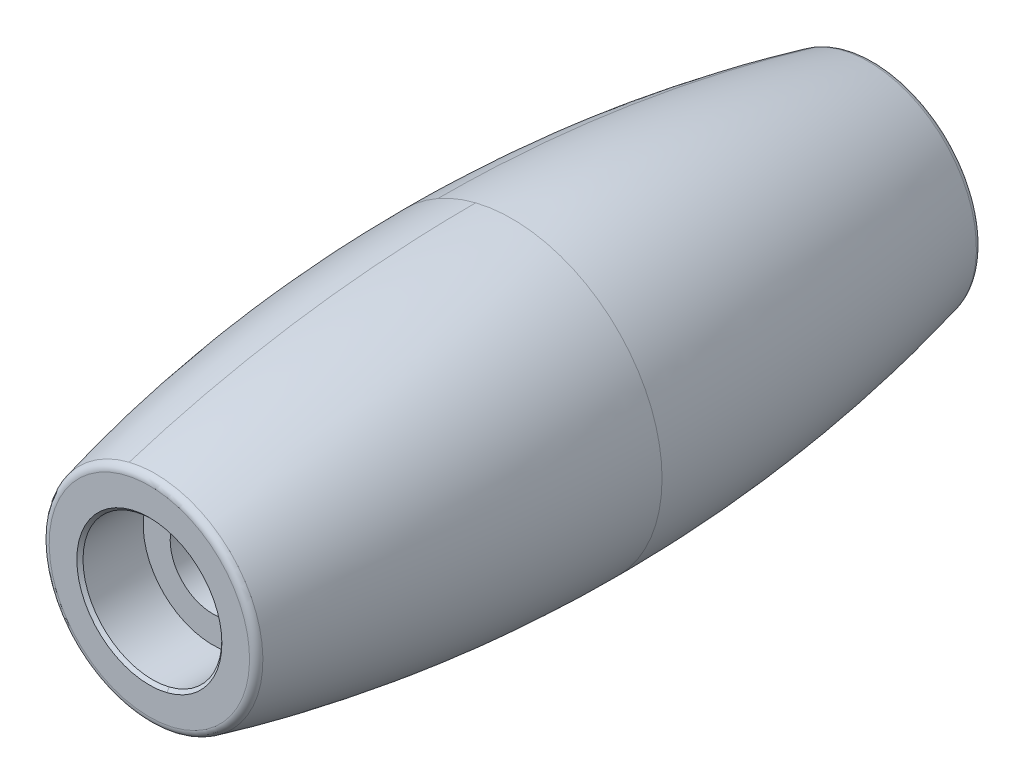
ISO-10303-21;
HEADER;
FILE_DESCRIPTION(('STEP AP214'),'2;1');
FILE_NAME('part.step','',(''),(''),'','','');
FILE_SCHEMA(('AUTOMOTIVE_DESIGN { 1 0 10303 214 1 1 1 1 }'));
ENDSEC;
DATA;
#1=APPLICATION_CONTEXT('core data for automotive mechanical design processes');
#2=APPLICATION_PROTOCOL_DEFINITION('international standard','automotive_design',2000,#1);
#3=PRODUCT_CONTEXT('',#1,'mechanical');
#4=PRODUCT('Part','Part','',(#3));
#5=PRODUCT_RELATED_PRODUCT_CATEGORY('part','',(#4));
#6=PRODUCT_DEFINITION_FORMATION('','',#4);
#7=PRODUCT_DEFINITION_CONTEXT('part definition',#1,'design');
#8=PRODUCT_DEFINITION('design','',#6,#7);
#9=PRODUCT_DEFINITION_SHAPE('','',#8);
#10=(LENGTH_UNIT() NAMED_UNIT(*) SI_UNIT(.MILLI.,.METRE.));
#11=(NAMED_UNIT(*) PLANE_ANGLE_UNIT() SI_UNIT($,.RADIAN.));
#12=(NAMED_UNIT(*) SI_UNIT($,.STERADIAN.) SOLID_ANGLE_UNIT());
#13=UNCERTAINTY_MEASURE_WITH_UNIT(LENGTH_MEASURE(1.E-05),#10,'distance_accuracy_value','');
#14=(GEOMETRIC_REPRESENTATION_CONTEXT(3) GLOBAL_UNCERTAINTY_ASSIGNED_CONTEXT((#13)) GLOBAL_UNIT_ASSIGNED_CONTEXT((#10,
#11,#12)) REPRESENTATION_CONTEXT('',''));
#15=CARTESIAN_POINT('',(0.,0.,0.));
#16=DIRECTION('',(0.,0.,1.));
#17=DIRECTION('',(1.,0.,0.));
#18=AXIS2_PLACEMENT_3D('',#15,#16,#17);
#19=CARTESIAN_POINT('',(-25.4705380913365,35.1579678977231,0.));
#20=DIRECTION('',(0.,0.,1.));
#21=DIRECTION('',(1.,0.,0.));
#22=AXIS2_PLACEMENT_3D('',#19,#20,#21);
#23=PLANE('',#22);
#24=CARTESIAN_POINT('',(-25.4705380913339,35.1579678977162,-5.38371430769402E-12));
#25=DIRECTION('',(0.,0.,1.));
#26=DIRECTION('',(1.,0.,0.));
#27=AXIS2_PLACEMENT_3D('',#24,#25,#26);
#28=CIRCLE('',#27,4.5);
#29=CARTESIAN_POINT('',(-20.9705380913339,35.1579678977162,-5.38509601494264E-12));
#30=VERTEX_POINT('',#29);
#31=EDGE_CURVE('E116',#30,#30,#28,.T.);
#32=ORIENTED_EDGE('',*,*,#31,.T.);
#33=EDGE_LOOP('',(#32));
#34=FACE_BOUND('',#33,.T.);
#35=CARTESIAN_POINT('',(-25.4705380913339,35.1579678977162,-1.4363510381088E-12));
#36=DIRECTION('',(0.,0.,-1.));
#37=DIRECTION('',(-1.,0.,0.));
#38=AXIS2_PLACEMENT_3D('',#35,#36,#37);
#39=CIRCLE('',#38,2.75);
#40=CARTESIAN_POINT('',(-28.2205380913339,35.1579678977162,-1.43550666145686E-12));
#41=VERTEX_POINT('',#40);
#42=EDGE_CURVE('E119',#41,#41,#39,.T.);
#43=ORIENTED_EDGE('',*,*,#42,.T.);
#44=EDGE_LOOP('',(#43));
#45=FACE_BOUND('',#44,.T.);
#46=ADVANCED_FACE('F16',(#34,#45),#23,.T.);
#47=CARTESIAN_POINT('',(-25.4705380913339,35.1579678977162,4.09999999999955));
#48=DIRECTION('',(0.,0.,-1.));
#49=DIRECTION('',(-1.,0.,0.));
#50=AXIS2_PLACEMENT_3D('',#47,#48,#49);
#51=CYLINDRICAL_SURFACE('',#50,2.75);
#52=ORIENTED_EDGE('',*,*,#42,.F.);
#53=EDGE_LOOP('',(#52));
#54=FACE_BOUND('',#53,.T.);
#55=CARTESIAN_POINT('',(-25.4705380913339,35.1579678977162,-38.8000000000043));
#56=DIRECTION('',(0.,0.,-1.));
#57=DIRECTION('',(-1.,0.,0.));
#58=AXIS2_PLACEMENT_3D('',#55,#56,#57);
#59=CIRCLE('',#58,2.75);
#60=CARTESIAN_POINT('',(-28.2205380913339,35.1579678977162,-38.8000000000043));
#61=VERTEX_POINT('',#60);
#62=EDGE_CURVE('E112',#61,#61,#59,.F.);
#63=ORIENTED_EDGE('',*,*,#62,.F.);
#64=EDGE_LOOP('',(#63));
#65=FACE_BOUND('',#64,.T.);
#66=ADVANCED_FACE('F383',(#54,#65),#51,.F.);
#67=CARTESIAN_POINT('',(-25.4705380913339,35.1579678977162,4.09999999999955));
#68=DIRECTION('',(0.,0.,1.));
#69=DIRECTION('',(1.,0.,0.));
#70=AXIS2_PLACEMENT_3D('',#67,#68,#69);
#71=CYLINDRICAL_SURFACE('',#70,4.5);
#72=ORIENTED_EDGE('',*,*,#31,.F.);
#73=EDGE_LOOP('',(#72));
#74=FACE_BOUND('',#73,.T.);
#75=CARTESIAN_POINT('',(-25.4705380913304,35.1579678977177,3.89999999998735));
#76=DIRECTION('',(0.,0.,1.));
#77=DIRECTION('',(-0.992768102714452,-0.12004788308316,0.));
#78=AXIS2_PLACEMENT_3D('',#75,#76,#77);
#79=CIRCLE('',#78,4.50000000001804);
#80=CARTESIAN_POINT('',(-26.5593346272201,39.5242617612346,3.89999999987367));
#81=VERTEX_POINT('',#80);
#82=CARTESIAN_POINT('',(-24.381741555437,30.7916740341321,3.89999999991156));
#83=VERTEX_POINT('',#82);
#84=EDGE_CURVE('E115',#81,#83,#79,.T.);
#85=ORIENTED_EDGE('',*,*,#84,.T.);
#86=CARTESIAN_POINT('',(-25.4705380913304,35.1579678977177,3.89999999987367));
#87=DIRECTION('',(0.,0.,1.));
#88=DIRECTION('',(-0.992768102714646,-0.120047883081553,0.));
#89=AXIS2_PLACEMENT_3D('',#86,#87,#88);
#90=CIRCLE('',#89,4.4999999999599);
#91=EDGE_CURVE('E100',#83,#81,#90,.T.);
#92=ORIENTED_EDGE('',*,*,#91,.T.);
#93=EDGE_LOOP('',(#85,#92));
#94=FACE_BOUND('',#93,.T.);
#95=ADVANCED_FACE('F374',(#74,#94),#71,.F.);
#96=CARTESIAN_POINT('',(-25.4705380913347,35.1579678977238,-38.8000000000057));
#97=DIRECTION('',(0.,0.,-1.));
#98=DIRECTION('',(0.,1.,0.));
#99=AXIS2_PLACEMENT_3D('',#96,#97,#98);
#100=PLANE('',#99);
#101=CARTESIAN_POINT('',(-25.4705380913318,35.157967897717,-38.8000000000003));
#102=DIRECTION('',(0.,0.,-1.));
#103=DIRECTION('',(-1.,0.,0.));
#104=AXIS2_PLACEMENT_3D('',#101,#102,#103);
#105=CIRCLE('',#104,4.5);
#106=CARTESIAN_POINT('',(-29.9705380913318,35.157967897717,-38.8000000000003));
#107=VERTEX_POINT('',#106);
#108=EDGE_CURVE('E95',#107,#107,#105,.T.);
#109=ORIENTED_EDGE('',*,*,#108,.T.);
#110=EDGE_LOOP('',(#109));
#111=FACE_BOUND('',#110,.T.);
#112=ORIENTED_EDGE('',*,*,#62,.T.);
#113=EDGE_LOOP('',(#112));
#114=FACE_BOUND('',#113,.T.);
#115=ADVANCED_FACE('F366',(#111,#114),#100,.T.);
#116=CARTESIAN_POINT('',(-25.4705380913304,35.1579678977177,4.09999999999399));
#117=DIRECTION('',(0.,0.,1.));
#118=DIRECTION('',(1.,0.,0.));
#119=AXIS2_PLACEMENT_3D('',#116,#117,#118);
#120=CONICAL_SURFACE('',#119,4.70000000005329,0.785398163468979);
#121=ORIENTED_EDGE('',*,*,#84,.F.);
#122=DIRECTION('',(0.171087869736242,-0.686096888770337,-0.707106781221039));
#123=VECTOR('',#122,1.);
#124=CARTESIAN_POINT('',(-120761.053788592,484209.215192093,499000.));
#125=LINE('',#124,#123);
#126=CARTESIAN_POINT('',(-26.6077255843697,39.7183192663404,4.09999999993909));
#127=VERTEX_POINT('',#126);
#128=EDGE_CURVE('E92',#81,#127,#125,.F.);
#129=ORIENTED_EDGE('',*,*,#128,.T.);
#130=CARTESIAN_POINT('',(-25.4705380913304,35.1579678977177,4.09999999999788));
#131=DIRECTION('',(0.,0.,1.));
#132=DIRECTION('',(1.,0.,0.));
#133=AXIS2_PLACEMENT_3D('',#130,#131,#132);
#134=CIRCLE('',#133,4.70000000005718);
#135=CARTESIAN_POINT('',(-24.3333505983129,30.5976165291249,4.09999999986775));
#136=VERTEX_POINT('',#135);
#137=EDGE_CURVE('E83',#136,#127,#134,.F.);
#138=ORIENTED_EDGE('',*,*,#137,.F.);
#139=DIRECTION('',(-0.171087869739916,0.686096888769421,-0.707106781221039));
#140=VECTOR('',#139,1.);
#141=CARTESIAN_POINT('',(120710.112715003,-484138.899255651,498999.999999999));
#142=LINE('',#141,#140);
#143=EDGE_CURVE('E90',#136,#83,#142,.T.);
#144=ORIENTED_EDGE('',*,*,#143,.T.);
#145=EDGE_LOOP('',(#121,#129,#138,#144));
#146=FACE_BOUND('',#145,.T.);
#147=ADVANCED_FACE('F89',(#146),#120,.F.);
#148=CARTESIAN_POINT('',(-25.4705380913304,35.1579678977177,4.09999999976662));
#149=DIRECTION('',(0.,0.,1.));
#150=DIRECTION('',(1.,0.,0.));
#151=AXIS2_PLACEMENT_3D('',#148,#149,#150);
#152=CONICAL_SURFACE('',#151,4.6999999998233,0.785398163323554);
#153=ORIENTED_EDGE('',*,*,#143,.F.);
#154=CARTESIAN_POINT('',(-25.4705380913304,35.1579678977177,4.09999999988031));
#155=DIRECTION('',(0.,0.,1.));
#156=DIRECTION('',(1.,0.,0.));
#157=AXIS2_PLACEMENT_3D('',#154,#155,#156);
#158=CIRCLE('',#157,4.69999999993698);
#159=EDGE_CURVE('E94',#127,#136,#158,.F.);
#160=ORIENTED_EDGE('',*,*,#159,.F.);
#161=ORIENTED_EDGE('',*,*,#128,.F.);
#162=ORIENTED_EDGE('',*,*,#91,.F.);
#163=EDGE_LOOP('',(#153,#160,#161,#162));
#164=FACE_BOUND('',#163,.T.);
#165=ADVANCED_FACE('F99',(#164),#152,.F.);
#166=CARTESIAN_POINT('',(-25.4705380913318,35.157967897717,-42.9000000000053));
#167=DIRECTION('',(0.,0.,-1.));
#168=DIRECTION('',(-1.,0.,0.));
#169=AXIS2_PLACEMENT_3D('',#166,#167,#168);
#170=CYLINDRICAL_SURFACE('',#169,4.5);
#171=ORIENTED_EDGE('',*,*,#108,.F.);
#172=EDGE_LOOP('',(#171));
#173=FACE_BOUND('',#172,.T.);
#174=CARTESIAN_POINT('',(-25.4705380913354,35.1579678977158,-42.6999999998543));
#175=DIRECTION('',(0.,0.,-1.));
#176=DIRECTION('',(0.801876473708361,0.597489850050228,0.));
#177=AXIS2_PLACEMENT_3D('',#174,#175,#176);
#178=CIRCLE('',#177,4.49999999990264);
#179=CARTESIAN_POINT('',(-21.8620939597258,37.8466722228836,-42.6999999998543));
#180=VERTEX_POINT('',#179);
#181=EDGE_CURVE('E105',#180,#180,#178,.T.);
#182=ORIENTED_EDGE('',*,*,#181,.T.);
#183=EDGE_LOOP('',(#182));
#184=FACE_BOUND('',#183,.T.);
#185=ADVANCED_FACE('F249',(#173,#184),#170,.F.);
#186=CARTESIAN_POINT('',(-25.4705380913339,35.1579678977162,4.09999999999955));
#187=DIRECTION('',(0.,0.,1.));
#188=DIRECTION('',(1.,0.,0.));
#189=AXIS2_PLACEMENT_3D('',#186,#187,#188);
#190=PLANE('',#189);
#191=CARTESIAN_POINT('',(-25.4705380913344,35.1579678977216,4.09999999993212));
#192=DIRECTION('',(0.,0.,1.));
#193=DIRECTION('',(0.,-1.,0.));
#194=AXIS2_PLACEMENT_3D('',#191,#192,#193);
#195=CIRCLE('',#194,6.49164759475628);
#196=CARTESIAN_POINT('',(-24.0715649100562,28.8188562899876,4.09999999998257));
#197=VERTEX_POINT('',#196);
#198=CARTESIAN_POINT('',(-23.8998548688773,28.8592111569681,4.09999999999931));
#199=VERTEX_POINT('',#198);
#200=EDGE_CURVE('E150',#197,#199,#195,.F.);
#201=ORIENTED_EDGE('',*,*,#200,.F.);
#202=DIRECTION('',(-0.973474515332626,-0.228795471978598,0.));
#203=VECTOR('',#202,1.);
#204=CARTESIAN_POINT('',(-23.899854868877,28.8592111569668,4.09999999999955));
#205=LINE('',#204,#203);
#206=EDGE_CURVE('E103',#197,#199,#205,.F.);
#207=ORIENTED_EDGE('',*,*,#206,.T.);
#208=EDGE_LOOP('',(#201,#207));
#209=FACE_BOUND('',#208,.T.);
#210=ORIENTED_EDGE('',*,*,#137,.T.);
#211=ORIENTED_EDGE('',*,*,#159,.T.);
#212=EDGE_LOOP('',(#210,#211));
#213=FACE_BOUND('',#212,.T.);
#214=ADVANCED_FACE('F102',(#209,#213),#190,.T.);
#215=CARTESIAN_POINT('',(-25.4705380913354,35.1579678977158,-42.8999999999746));
#216=DIRECTION('',(0.,0.,-1.));
#217=DIRECTION('',(-1.,0.,0.));
#218=AXIS2_PLACEMENT_3D('',#215,#216,#217);
#219=CONICAL_SURFACE('',#218,4.70000000000329,0.785398163376875);
#220=CARTESIAN_POINT('',(-25.4705380913354,35.1579678977158,-42.8999999999746));
#221=DIRECTION('',(0.,0.,-1.));
#222=DIRECTION('',(-1.,0.,0.));
#223=AXIS2_PLACEMENT_3D('',#220,#221,#222);
#224=CIRCLE('',#223,4.7000000000033);
#225=CARTESIAN_POINT('',(-30.1705380913387,35.1579678977158,-42.8999999999746));
#226=VERTEX_POINT('',#225);
#227=EDGE_CURVE('E145',#226,#226,#224,.F.);
#228=ORIENTED_EDGE('',*,*,#227,.F.);
#229=EDGE_LOOP('',(#228));
#230=FACE_BOUND('',#229,.T.);
#231=ORIENTED_EDGE('',*,*,#181,.F.);
#232=EDGE_LOOP('',(#231));
#233=FACE_BOUND('',#232,.T.);
#234=ADVANCED_FACE('F240',(#230,#233),#219,.F.);
#235=CARTESIAN_POINT('',(-25.4705380913344,35.1579678977216,3.59999999999907));
#236=DIRECTION('',(0.,0.,1.));
#237=DIRECTION('',(0.,-1.,0.));
#238=AXIS2_PLACEMENT_3D('',#235,#236,#237);
#239=TOROIDAL_SURFACE('',#238,6.491639412702,0.500000000000001);
#240=ORIENTED_EDGE('',*,*,#206,.F.);
#241=ORIENTED_EDGE('',*,*,#200,.T.);
#242=EDGE_LOOP('',(#240,#241));
#243=FACE_BOUND('',#242,.T.);
#244=CARTESIAN_POINT('',(-25.4705380913328,35.1579678977165,3.71878560170896));
#245=DIRECTION('',(0.,0.,1.));
#246=DIRECTION('',(1.,0.,0.));
#247=AXIS2_PLACEMENT_3D('',#244,#245,#246);
#248=CIRCLE('',#247,6.97732447611853);
#249=CARTESIAN_POINT('',(-27.158735140061,41.9279787965108,3.71878560170784));
#250=VERTEX_POINT('',#249);
#251=CARTESIAN_POINT('',(-23.7823410425976,28.3879569989313,3.7187856017084));
#252=VERTEX_POINT('',#251);
#253=EDGE_CURVE('E121',#250,#252,#248,.T.);
#254=ORIENTED_EDGE('',*,*,#253,.T.);
#255=CARTESIAN_POINT('',(-25.4705380913328,35.1579678977165,3.7187856017084));
#256=DIRECTION('',(0.,0.,1.));
#257=DIRECTION('',(1.,0.,0.));
#258=AXIS2_PLACEMENT_3D('',#255,#256,#257);
#259=CIRCLE('',#258,6.9773244761187);
#260=EDGE_CURVE('E189',#252,#250,#259,.T.);
#261=ORIENTED_EDGE('',*,*,#260,.T.);
#262=EDGE_LOOP('',(#254,#261));
#263=FACE_BOUND('',#262,.T.);
#264=ADVANCED_FACE('F210',(#243,#263),#239,.T.);
#265=CARTESIAN_POINT('',(-25.4705380913318,35.157967897717,-42.9000000000053));
#266=DIRECTION('',(0.,0.,-1.));
#267=DIRECTION('',(0.,1.,0.));
#268=AXIS2_PLACEMENT_3D('',#265,#266,#267);
#269=PLANE('',#268);
#270=DIRECTION('',(-0.862875279156614,-0.505416909709594,0.));
#271=VECTOR('',#270,1.);
#272=CARTESIAN_POINT('',(-28.6753809247973,40.8033522670363,-42.9000000000053));
#273=LINE('',#272,#271);
#274=CARTESIAN_POINT('',(-28.8275801992505,40.7141994422734,-42.899999999968));
#275=VERTEX_POINT('',#274);
#276=CARTESIAN_POINT('',(-28.6753809247969,40.8033522670356,-42.900000000005));
#277=VERTEX_POINT('',#276);
#278=EDGE_CURVE('E129',#275,#277,#273,.F.);
#279=ORIENTED_EDGE('',*,*,#278,.T.);
#280=CARTESIAN_POINT('',(-25.4705380913352,35.1579678977213,-42.8999999999378));
#281=DIRECTION('',(0.,0.,-1.));
#282=DIRECTION('',(-1.,0.,0.));
#283=AXIS2_PLACEMENT_3D('',#280,#281,#282);
#284=CIRCLE('',#283,6.49164759475794);
#285=CARTESIAN_POINT('',(-22.1134959839628,29.6017363528401,-42.899999999968));
#286=VERTEX_POINT('',#285);
#287=EDGE_CURVE('E123',#277,#286,#284,.T.);
#288=ORIENTED_EDGE('',*,*,#287,.T.);
#289=DIRECTION('',(0.862875279148884,0.50541690972279,0.));
#290=VECTOR('',#289,1.);
#291=CARTESIAN_POINT('',(-22.2656952576629,29.5125835285244,-42.9000000000053));
#292=LINE('',#291,#290);
#293=CARTESIAN_POINT('',(-22.2656952576635,29.5125835285255,-42.900000000005));
#294=VERTEX_POINT('',#293);
#295=EDGE_CURVE('E134',#286,#294,#292,.F.);
#296=ORIENTED_EDGE('',*,*,#295,.T.);
#297=CARTESIAN_POINT('',(-25.4705380913352,35.1579678977213,-42.8999999999379));
#298=DIRECTION('',(0.,0.,-1.));
#299=DIRECTION('',(-1.,0.,0.));
#300=AXIS2_PLACEMENT_3D('',#297,#298,#299);
#301=CIRCLE('',#300,6.49164759475629);
#302=EDGE_CURVE('E175',#275,#294,#301,.F.);
#303=ORIENTED_EDGE('',*,*,#302,.F.);
#304=EDGE_LOOP('',(#279,#288,#296,#303));
#305=FACE_BOUND('',#304,.T.);
#306=ORIENTED_EDGE('',*,*,#227,.T.);
#307=EDGE_LOOP('',(#306));
#308=FACE_BOUND('',#307,.T.);
#309=ADVANCED_FACE('F234',(#305,#308),#269,.T.);
#310=CARTESIAN_POINT('',(-23.7823410425851,28.3879569989334,3.71878560170896));
#311=CARTESIAN_POINT('',(-27.7481216097051,27.3990340637286,3.71878560170896));
#312=CARTESIAN_POINT('',(-31.2516260549588,29.5039902818975,3.71878560170896));
#313=CARTESIAN_POINT('',(-32.2405489901302,33.4697708490258,3.71878560170896));
#314=CARTESIAN_POINT('',(-33.2294719253015,37.4355514161542,3.71878560170896));
#315=CARTESIAN_POINT('',(-31.124515707103,40.9390558613902,3.71878560170896));
#316=CARTESIAN_POINT('',(-27.1587351399663,41.9279787965281,3.71878560170896));
#317=CARTESIAN_POINT('',(-23.7011219892225,28.0622522022884,2.34627833576507));
#318=CARTESIAN_POINT('',(-27.8576960088884,27.0257522471466,2.34627833576507));
#319=CARTESIAN_POINT('',(-31.529753831669,29.2319777759914,2.34627833576508));
#320=CARTESIAN_POINT('',(-32.5662537867758,33.388551795666,2.34627833576508));
#321=CARTESIAN_POINT('',(-33.6027537418825,37.5451258153407,2.34627833576508));
#322=CARTESIAN_POINT('',(-31.3965282130068,41.2171836381027,2.34627833576508));
#323=CARTESIAN_POINT('',(-27.2399541933234,42.2536835931744,2.34627833576508));
#324=CARTESIAN_POINT('',(-23.61616954226,27.7215757437804,0.754474956609358));
#325=CARTESIAN_POINT('',(-27.9723072109401,26.6353117973644,0.75447495660936));
#326=CARTESIAN_POINT('',(-31.8206662989053,28.9474616800172,0.754474956609362));
#327=CARTESIAN_POINT('',(-32.9069302452845,33.3035993487064,0.754474956609362));
#328=CARTESIAN_POINT('',(-33.9931941916638,37.6597370173956,0.754474956609362));
#329=CARTESIAN_POINT('',(-31.6810443089785,41.5080961053414,0.754474956609363));
#330=CARTESIAN_POINT('',(-27.3249066402802,42.5943600516839,0.754474956609361));
#331=CARTESIAN_POINT('',(-23.3881529624464,26.8071832375407,-4.12168095351292));
#332=CARTESIAN_POINT('',(-28.2799293599529,25.587350271115,-4.12168095351292));
#333=CARTESIAN_POINT('',(-32.6014897851416,28.1838063713838,-4.12168095351292));
#334=CARTESIAN_POINT('',(-33.8213227515261,33.0755827689005,-4.12168095351292));
#335=CARTESIAN_POINT('',(-35.0411557179106,37.9673591664173,-4.12168095351292));
#336=CARTESIAN_POINT('',(-32.4446996176054,42.2889195915842,-4.12168095351292));
#337=CARTESIAN_POINT('',(-27.5529232200783,43.5087525579274,-4.12168095351292));
#338=CARTESIAN_POINT('',(-23.1804991244381,25.9744494358,-10.4110723648236));
#339=CARTESIAN_POINT('',(-28.560079689161,24.632975667347,-10.4110723648236));
#340=CARTESIAN_POINT('',(-33.312582784861,27.488348366165,-10.4110723648236));
#341=CARTESIAN_POINT('',(-34.6540565532686,32.8679289308992,-10.4110723648236));
#342=CARTESIAN_POINT('',(-35.9955303216763,38.2475094956335,-10.4110723648236));
#343=CARTESIAN_POINT('',(-33.1401576228182,43.0000125913093,-10.4110723648236));
#344=CARTESIAN_POINT('',(-27.7605770580726,44.3414863596716,-10.4110723648236));
#345=CARTESIAN_POINT('',(-23.1177850925914,25.7229535103554,-16.6126877546769));
#346=CARTESIAN_POINT('',(-28.6446885595591,24.3447427125974,-16.6126877546769));
#347=CARTESIAN_POINT('',(-33.5273416810023,27.2783114320752,-16.6126877546769));
#348=CARTESIAN_POINT('',(-34.9055524787137,32.8052148990546,-16.6126877546769));
#349=CARTESIAN_POINT('',(-36.2837632764251,38.332118366034,-16.6126877546769));
#350=CARTESIAN_POINT('',(-33.3501945569062,43.2147714874525,-16.6126877546769));
#351=CARTESIAN_POINT('',(-27.8232910899151,44.5929822851172,-16.6126877546769));
#352=CARTESIAN_POINT('',(-23.1177983595231,25.7230067134297,-19.4000000000029));
#353=CARTESIAN_POINT('',(-28.6446706608516,24.3448036872604,-19.4000000000029));
#354=CARTESIAN_POINT('',(-33.5272962495167,27.2783558646463,-19.4000000000029));
#355=CARTESIAN_POINT('',(-34.9054992756394,32.8052281659864,-19.4000000000029));
#356=CARTESIAN_POINT('',(-36.2837023017621,38.3321004673264,-19.4000000000029));
#357=CARTESIAN_POINT('',(-33.350150124335,43.2147260559669,-19.4000000000028));
#358=CARTESIAN_POINT('',(-27.8232778229834,44.5929290820429,-19.4000000000029));
#359=(BOUNDED_SURFACE() B_SPLINE_SURFACE(3,3,((#310,#311,#312,#313,#314,#315,#316),(#317,#318,
#319,#320,#321,#322,#323),(#324,#325,#326,#327,#328,#329,#330),(#331,#332,#333,#334,#335,#336,
#337),(#338,#339,#340,#341,#342,#343,#344),(#345,#346,#347,#348,#349,#350,#351),(#352,#353,#354,
#355,#356,#357,#358)),.UNSPECIFIED.,.F.,.F.,.F.) B_SPLINE_SURFACE_WITH_KNOTS((4,1,1,1,4),(4,3,
4),(0.00998427053539977,0.1014477399545,0.1146764368519,0.3267895274159,0.499971373757003),(0.,
0.5,1.),.UNSPECIFIED.) GEOMETRIC_REPRESENTATION_ITEM() RATIONAL_B_SPLINE_SURFACE(((1.,
0.804737854122377,0.804737854122377,1.,0.804737854122377,0.804737854122377,1.),(1.,
0.804737854122377,0.804737854122377,1.,0.804737854122377,0.804737854122377,1.),(1.,
0.804737854122377,0.804737854122377,1.,0.804737854122377,0.804737854122377,1.),(1.,
0.804737854122377,0.804737854122377,1.,0.804737854122377,0.804737854122377,1.),(1.,
0.804737854122377,0.804737854122377,1.,0.804737854122377,0.804737854122377,1.),(1.,
0.804737854122377,0.804737854122377,1.,0.804737854122377,0.804737854122377,1.),(1.,
0.804737854122377,0.804737854122377,1.,0.804737854122377,0.804737854122377,1.))) REPRESENTATION_ITEM('') SURFACE());
#360=CARTESIAN_POINT('',(-27.1587351400797,41.9279787965,3.7187856017084));
#361=CARTESIAN_POINT('',(-27.2399541934423,42.2536835931449,2.34627833576469));
#362=CARTESIAN_POINT('',(-27.3249066404047,42.5943600516529,0.754474956609165));
#363=CARTESIAN_POINT('',(-27.5529232202181,43.5087525578925,-4.12168095351293));
#364=CARTESIAN_POINT('',(-27.7605770582264,44.3414863596333,-10.4110723648236));
#365=CARTESIAN_POINT('',(-27.8232910900731,44.5929822850778,-16.6126877546769));
#366=CARTESIAN_POINT('',(-27.8232778231413,44.5929290820036,-19.4000000000029));
#367=B_SPLINE_CURVE_WITH_KNOTS('',3,(#360,#361,#362,#363,#364,#365,#366),.UNSPECIFIED.,.F.,.F.,
(4,1,1,1,4),(0.00998427053541216,0.1014477399545,0.1146764368519,0.3267895274159,
0.499971373757003),.UNSPECIFIED.);
#368=CARTESIAN_POINT('',(-27.8232778230394,44.592929082029,-19.4000000000029));
#369=VERTEX_POINT('',#368);
#370=EDGE_CURVE('E122',#250,#369,#367,.T.);
#371=CARTESIAN_POINT('',(-25.4705380913328,35.1579678977165,-19.4000000000029));
#372=DIRECTION('',(0.,0.,1.));
#373=DIRECTION('',(1.,0.,0.));
#374=AXIS2_PLACEMENT_3D('',#371,#372,#373);
#375=CIRCLE('',#374,9.72388177605185);
#376=CARTESIAN_POINT('',(-30.2710993730104,43.6142370618036,-19.4000000000029));
#377=VERTEX_POINT('',#376);
#378=EDGE_CURVE('E177',#369,#377,#375,.T.);
#379=CARTESIAN_POINT('',(-25.4705380913328,35.1579678977165,-19.4000000000029));
#380=DIRECTION('',(0.,0.,1.));
#381=DIRECTION('',(1.,0.,0.));
#382=AXIS2_PLACEMENT_3D('',#379,#380,#381);
#383=CIRCLE('',#382,9.72388177605187);
#384=CARTESIAN_POINT('',(-23.117798359671,25.7230067133929,-19.4000000000029));
#385=VERTEX_POINT('',#384);
#386=EDGE_CURVE('E222',#377,#385,#383,.T.);
#387=CARTESIAN_POINT('',(-23.7823410426989,28.3879569989048,3.7187856017084));
#388=CARTESIAN_POINT('',(-23.7011219893418,28.0622522022586,2.3462783357647));
#389=CARTESIAN_POINT('',(-23.6161695423851,27.7215757437492,0.754474956609168));
#390=CARTESIAN_POINT('',(-23.3881529625869,26.8071832375057,-4.12168095351293));
#391=CARTESIAN_POINT('',(-23.1804991245926,25.9744494357615,-10.4110723648236));
#392=CARTESIAN_POINT('',(-23.1177850927501,25.7229535103159,-16.6126877546769));
#393=CARTESIAN_POINT('',(-23.1177983596818,25.7230067133901,-19.4000000000029));
#394=B_SPLINE_CURVE_WITH_KNOTS('',3,(#387,#388,#389,#390,#391,#392,#393),.UNSPECIFIED.,.F.,.F.,
(4,1,1,1,4),(0.00998427053541216,0.1014477399545,0.1146764368519,0.3267895274159,
0.499971373757003),.UNSPECIFIED.);
#395=EDGE_CURVE('E127',#385,#252,#394,.F.);
#396=ORIENTED_EDGE('',*,*,#253,.F.);
#397=ORIENTED_EDGE('',*,*,#370,.T.);
#398=ORIENTED_EDGE('',*,*,#378,.T.);
#399=ORIENTED_EDGE('',*,*,#386,.T.);
#400=ORIENTED_EDGE('',*,*,#395,.T.);
#401=EDGE_LOOP('',(#396,#397,#398,#399,#400));
#402=FACE_BOUND('',#401,.T.);
#403=ADVANCED_FACE('F214',(#402),#359,.F.);
#404=CARTESIAN_POINT('',(-27.1587351400797,41.9279787965,3.7187856017084));
#405=CARTESIAN_POINT('',(-23.1929545729598,42.9169017317042,3.7187856017084));
#406=CARTESIAN_POINT('',(-19.6894501277064,40.8119455135351,3.7187856017084));
#407=CARTESIAN_POINT('',(-18.7005271925352,36.8461649464069,3.7187856017084));
#408=CARTESIAN_POINT('',(-17.7116042573641,32.8803843792787,3.7187856017084));
#409=CARTESIAN_POINT('',(-19.8165604755625,29.3768799340429,3.7187856017084));
#410=CARTESIAN_POINT('',(-23.7823410426989,28.3879569989048,3.7187856017084));
#411=CARTESIAN_POINT('',(-27.2399541934423,42.2536835931449,2.34627833576469));
#412=CARTESIAN_POINT('',(-23.0833801737764,43.2901835482861,2.34627833576469));
#413=CARTESIAN_POINT('',(-19.4113223509962,41.0839580194412,2.34627833576469));
#414=CARTESIAN_POINT('',(-18.3748223958897,36.9273839997667,2.34627833576469));
#415=CARTESIAN_POINT('',(-17.3383224407831,32.7708099800922,2.34627833576469));
#416=CARTESIAN_POINT('',(-19.5445479696587,29.0987521573304,2.34627833576469));
#417=CARTESIAN_POINT('',(-23.7011219893418,28.0622522022586,2.3462783357647));
#418=CARTESIAN_POINT('',(-27.3249066404047,42.5943600516529,0.754474956609165));
#419=CARTESIAN_POINT('',(-22.9687689717248,43.6806239980682,0.754474956609163));
#420=CARTESIAN_POINT('',(-19.12040988376,41.3684741154152,0.754474956609164));
#421=CARTESIAN_POINT('',(-18.034145937381,37.0123364467263,0.754474956609164));
#422=CARTESIAN_POINT('',(-16.947881991002,32.6561987780373,0.754474956609164));
#423=CARTESIAN_POINT('',(-19.2600318736871,28.8078396900918,0.754474956609166));
#424=CARTESIAN_POINT('',(-23.6161695423851,27.7215757437492,0.754474956609168));
#425=CARTESIAN_POINT('',(-27.5529232202181,43.5087525578925,-4.12168095351293));
#426=CARTESIAN_POINT('',(-22.6611468227119,44.7285855243176,-4.12168095351293));
#427=CARTESIAN_POINT('',(-18.3395863975236,42.1321294240486,-4.12168095351293));
#428=CARTESIAN_POINT('',(-17.1197534311394,37.2403530265321,-4.12168095351293));
#429=CARTESIAN_POINT('',(-15.8999204647552,32.3485766290156,-4.12168095351293));
#430=CARTESIAN_POINT('',(-18.4963765650602,28.0270162038491,-4.12168095351293));
#431=CARTESIAN_POINT('',(-23.3881529625869,26.8071832375057,-4.12168095351293));
#432=CARTESIAN_POINT('',(-27.7605770582264,44.3414863596333,-10.4110723648236));
#433=CARTESIAN_POINT('',(-22.3809964935036,45.6829601280855,-10.4110723648236));
#434=CARTESIAN_POINT('',(-17.6284933978043,42.8275874292673,-10.4110723648236));
#435=CARTESIAN_POINT('',(-16.2870196293969,37.4480068645334,-10.4110723648236));
#436=CARTESIAN_POINT('',(-14.9455458609896,32.0684262997995,-10.4110723648236));
#437=CARTESIAN_POINT('',(-17.8009185598474,27.3159232041239,-10.4110723648236));
#438=CARTESIAN_POINT('',(-23.1804991245926,25.9744494357615,-10.4110723648236));
#439=CARTESIAN_POINT('',(-27.8232910900731,44.5929822850778,-16.6126877546769));
#440=CARTESIAN_POINT('',(-22.2963876231055,45.9711930828351,-16.6126877546769));
#441=CARTESIAN_POINT('',(-17.4137345016629,43.0376243633571,-16.6126877546769));
#442=CARTESIAN_POINT('',(-16.0355237039518,37.510720896378,-16.6126877546769));
#443=CARTESIAN_POINT('',(-14.6573129062407,31.9838174293989,-16.6126877546769));
#444=CARTESIAN_POINT('',(-17.5908816257595,27.1011643079808,-16.6126877546769));
#445=CARTESIAN_POINT('',(-23.1177850927501,25.7229535103159,-16.6126877546769));
#446=CARTESIAN_POINT('',(-27.8232778231413,44.5929290820036,-19.4000000000029));
#447=CARTESIAN_POINT('',(-22.2964055218131,45.9711321081721,-19.4000000000029));
#448=CARTESIAN_POINT('',(-17.4137799331485,43.037579930786,-19.4000000000029));
#449=CARTESIAN_POINT('',(-16.0355769070261,37.5107076294462,-19.4000000000029));
#450=CARTESIAN_POINT('',(-14.6573738809037,31.9838353281065,-19.4000000000029));
#451=CARTESIAN_POINT('',(-17.5909260583306,27.1012097394664,-19.4000000000029));
#452=CARTESIAN_POINT('',(-23.1177983596818,25.7230067133901,-19.4000000000029));
#453=(BOUNDED_SURFACE() B_SPLINE_SURFACE(3,3,((#404,#405,#406,#407,#408,#409,#410),(#411,#412,
#413,#414,#415,#416,#417),(#418,#419,#420,#421,#422,#423,#424),(#425,#426,#427,#428,#429,#430,
#431),(#432,#433,#434,#435,#436,#437,#438),(#439,#440,#441,#442,#443,#444,#445),(#446,#447,#448,
#449,#450,#451,#452)),.UNSPECIFIED.,.F.,.F.,.F.) B_SPLINE_SURFACE_WITH_KNOTS((4,1,1,1,4),(4,3,
4),(0.00998427053541216,0.1014477399545,0.1146764368519,0.3267895274159,0.499971373757003),(0.,
0.5,1.),.UNSPECIFIED.) GEOMETRIC_REPRESENTATION_ITEM() RATIONAL_B_SPLINE_SURFACE(((1.,
0.804737854122397,0.804737854122397,1.,0.804737854122397,0.804737854122397,1.),(1.,
0.804737854122397,0.804737854122397,1.,0.804737854122397,0.804737854122397,1.),(1.,
0.804737854122397,0.804737854122397,1.,0.804737854122397,0.804737854122397,1.),(1.,
0.804737854122397,0.804737854122397,1.,0.804737854122397,0.804737854122397,1.),(1.,
0.804737854122397,0.804737854122397,1.,0.804737854122397,0.804737854122397,1.),(1.,
0.804737854122397,0.804737854122397,1.,0.804737854122397,0.804737854122397,1.),(1.,
0.804737854122397,0.804737854122397,1.,0.804737854122397,0.804737854122397,1.))) REPRESENTATION_ITEM('') SURFACE());
#454=CARTESIAN_POINT('',(-25.4705380913328,35.1579678977165,-19.4000000000029));
#455=DIRECTION('',(0.,0.,1.));
#456=DIRECTION('',(1.,0.,0.));
#457=AXIS2_PLACEMENT_3D('',#454,#455,#456);
#458=CIRCLE('',#457,9.72388177605187);
#459=CARTESIAN_POINT('',(-20.6699768096554,26.7016987336292,-19.4000000000029));
#460=VERTEX_POINT('',#459);
#461=EDGE_CURVE('E223',#385,#460,#458,.T.);
#462=CARTESIAN_POINT('',(-25.4705380913328,35.1579678977165,-19.4000000000029));
#463=DIRECTION('',(0.,0.,1.));
#464=DIRECTION('',(1.,0.,0.));
#465=AXIS2_PLACEMENT_3D('',#462,#463,#464);
#466=CIRCLE('',#465,9.72388177605185);
#467=EDGE_CURVE('E182',#460,#369,#466,.T.);
#468=ORIENTED_EDGE('',*,*,#395,.F.);
#469=ORIENTED_EDGE('',*,*,#461,.T.);
#470=ORIENTED_EDGE('',*,*,#467,.T.);
#471=ORIENTED_EDGE('',*,*,#370,.F.);
#472=ORIENTED_EDGE('',*,*,#260,.F.);
#473=EDGE_LOOP('',(#468,#469,#470,#471,#472));
#474=FACE_BOUND('',#473,.T.);
#475=ADVANCED_FACE('F212',(#474),#453,.F.);
#476=CARTESIAN_POINT('',(-22.0259184939202,29.090212738338,-42.5187856017147));
#477=CARTESIAN_POINT('',(-18.4715098146918,31.1080241812997,-42.5187856017147));
#478=CARTESIAN_POINT('',(-17.3849714889918,35.0481788159691,-42.5187856017147));
#479=CARTESIAN_POINT('',(-19.4027829319835,38.6025874951804,-42.5187856017147));
#480=CARTESIAN_POINT('',(-21.4205943749753,42.1569961743918,-42.5187856017147));
#481=CARTESIAN_POINT('',(-25.3607490096538,43.2435345000585,-42.5187856017147));
#482=CARTESIAN_POINT('',(-28.9151576888481,41.2257230570366,-42.5187856017147));
#483=CARTESIAN_POINT('',(-21.860198062702,28.7982934209514,-41.1462783357708));
#484=CARTESIAN_POINT('',(-18.134787006466,30.9131816449591,-41.1462783357708));
#485=CARTESIAN_POINT('',(-16.9959753905591,35.0428968701831,-41.1462783357708));
#486=CARTESIAN_POINT('',(-19.1108636145983,38.7683079264011,-41.1462783357708));
#487=CARTESIAN_POINT('',(-21.2257518386375,42.4937189826192,-41.1462783357708));
#488=CARTESIAN_POINT('',(-25.3554670638711,43.6325305984912,-41.1462783357708));
#489=CARTESIAN_POINT('',(-29.0808781200712,41.5176423744205,-41.1462783357708));
#490=CARTESIAN_POINT('',(-21.6868599657756,28.4929554577362,-39.5544749566151));
#491=CARTESIAN_POINT('',(-17.7825860717943,30.7093827880481,-39.5544749566151));
#492=CARTESIAN_POINT('',(-16.5890983210396,35.0373721293676,-39.5544749566151));
#493=CARTESIAN_POINT('',(-18.8055256513845,38.9416460233301,-39.5544749566151));
#494=CARTESIAN_POINT('',(-21.0219529817295,42.8459199172926,-39.5544749566151));
#495=CARTESIAN_POINT('',(-25.3499423230591,44.0394076680107,-39.5544749566151));
#496=CARTESIAN_POINT('',(-29.2542162170028,41.8229803376327,-39.5544749566151));
#497=CARTESIAN_POINT('',(-21.2216119190879,27.6734132250291,-34.6783190464928));
#498=CARTESIAN_POINT('',(-16.8372613001212,30.1623765512249,-34.6783190464928));
#499=CARTESIAN_POINT('',(-15.4970200924486,35.022543451079,-34.6783190464928));
#500=CARTESIAN_POINT('',(-17.9859834186814,39.4068940700247,-34.6783190464928));
#501=CARTESIAN_POINT('',(-20.4749467449142,43.7912446889704,-34.6783190464928));
#502=CARTESIAN_POINT('',(-25.3351136447797,45.1314858966019,-34.6783190464928));
#503=CARTESIAN_POINT('',(-29.7194642637043,42.642522570332,-34.6783190464928));
#504=CARTESIAN_POINT('',(-20.7979122802262,26.9270592091428,-28.3889276351821));
#505=CARTESIAN_POINT('',(-15.976357601082,29.6642200374129,-28.3889276351821));
#506=CARTESIAN_POINT('',(-14.5024685744879,35.0090390297716,-28.3889276351821));
#507=CARTESIAN_POINT('',(-17.2396294027987,39.8305937088927,-28.3889276351821));
#508=CARTESIAN_POINT('',(-19.9767902311095,44.6521483880138,-28.3889276351821));
#509=CARTESIAN_POINT('',(-25.3216092234807,46.1260374145627,-28.3889276351821));
#510=CARTESIAN_POINT('',(-30.1431639025787,43.3888765862111,-28.3889276351821));
#511=CARTESIAN_POINT('',(-20.6699497397803,26.7016510492454,-22.1873122453288));
#512=CARTESIAN_POINT('',(-15.7163540176368,29.5137705982335,-22.1873122453288));
#513=CARTESIAN_POINT('',(-14.2021016938724,35.0049605272209,-22.1873122453288));
#514=CARTESIAN_POINT('',(-17.0142212429024,39.9585562493405,-22.1873122453288));
#515=CARTESIAN_POINT('',(-19.8263407919323,44.9121519714602,-22.1873122453288));
#516=CARTESIAN_POINT('',(-25.3175307209325,46.4264042951781,-22.1873122453288));
#517=CARTESIAN_POINT('',(-30.2711264430284,43.6142847461063,-22.1873122453288));
#518=CARTESIAN_POINT('',(-20.6699768098036,26.7016987335451,-19.4000000000029));
#519=CARTESIAN_POINT('',(-15.7164090204761,29.5138024252806,-19.4000000000029));
#520=CARTESIAN_POINT('',(-14.2021652354246,35.0049613900136,-19.4000000000029));
#521=CARTESIAN_POINT('',(-17.014268927202,39.9585291793173,-19.4000000000029));
#522=CARTESIAN_POINT('',(-19.8263726189795,44.9120969686209,-19.4000000000029));
#523=CARTESIAN_POINT('',(-25.3175315837253,46.426340753626,-19.4000000000028));
#524=CARTESIAN_POINT('',(-30.2710993730051,43.6142370618066,-19.4000000000028));
#525=(BOUNDED_SURFACE() B_SPLINE_SURFACE(3,3,((#476,#477,#478,#479,#480,#481,#482),(#483,#484,
#485,#486,#487,#488,#489),(#490,#491,#492,#493,#494,#495,#496),(#497,#498,#499,#500,#501,#502,
#503),(#504,#505,#506,#507,#508,#509,#510),(#511,#512,#513,#514,#515,#516,#517),(#518,#519,#520,
#521,#522,#523,#524)),.UNSPECIFIED.,.F.,.F.,.F.) B_SPLINE_SURFACE_WITH_KNOTS((4,1,1,1,4),(4,3,
4),(0.00998427053539968,0.1014477399545,0.1146764368519,0.3267895274159,0.499971373757003),(0.,
0.5,1.),.UNSPECIFIED.) GEOMETRIC_REPRESENTATION_ITEM() RATIONAL_B_SPLINE_SURFACE(((1.,
0.804737854122371,0.804737854122371,1.,0.804737854122371,0.804737854122371,1.),(1.,
0.804737854122371,0.804737854122371,1.,0.804737854122371,0.804737854122371,1.),(1.,
0.804737854122371,0.804737854122371,1.,0.804737854122371,0.804737854122371,1.),(1.,
0.804737854122371,0.804737854122371,1.,0.804737854122371,0.804737854122371,1.),(1.,
0.804737854122371,0.804737854122371,1.,0.804737854122371,0.804737854122371,1.),(1.,
0.804737854122371,0.804737854122371,1.,0.804737854122371,0.804737854122371,1.),(1.,
0.804737854122371,0.804737854122371,1.,0.804737854122371,0.804737854122371,1.))) REPRESENTATION_ITEM('') SURFACE());
#526=CARTESIAN_POINT('',(-25.4705380913352,35.1579678977213,-42.518785601713));
#527=DIRECTION('',(0.,0.,-1.));
#528=DIRECTION('',(0.,1.,0.));
#529=AXIS2_PLACEMENT_3D('',#526,#527,#528);
#530=CIRCLE('',#529,6.97732447611947);
#531=CARTESIAN_POINT('',(-28.9151576887659,41.2257230570869,-42.518785601714));
#532=VERTEX_POINT('',#531);
#533=CARTESIAN_POINT('',(-22.0259184939095,29.0902127383453,-42.5187856017141));
#534=VERTEX_POINT('',#533);
#535=EDGE_CURVE('E33',#532,#534,#530,.T.);
#536=CARTESIAN_POINT('',(-28.9151576887463,41.2257230570946,-42.5187856017141));
#537=CARTESIAN_POINT('',(-29.0808781199645,41.5176423744812,-41.1462783357704));
#538=CARTESIAN_POINT('',(-29.2542162168909,41.8229803376963,-39.5544749566149));
#539=CARTESIAN_POINT('',(-29.7194642635786,42.6425225704033,-34.6783190464928));
#540=CARTESIAN_POINT('',(-30.1431639024404,43.3888765862895,-28.3889276351821));
#541=CARTESIAN_POINT('',(-30.2711264428864,43.6142847461869,-22.1873122453288));
#542=CARTESIAN_POINT('',(-30.2710993728631,43.6142370618873,-19.4000000000028));
#543=B_SPLINE_CURVE_WITH_KNOTS('',3,(#536,#537,#538,#539,#540,#541,#542),.UNSPECIFIED.,.F.,.F.,
(4,1,1,1,4),(0.00998427053541213,0.1014477399545,0.1146764368519,0.3267895274159,
0.499971373757003),.UNSPECIFIED.);
#544=EDGE_CURVE('E180',#532,#377,#543,.T.);
#545=CARTESIAN_POINT('',(-22.0259184938175,29.0902127383962,-42.5187856017141));
#546=CARTESIAN_POINT('',(-21.8601980625944,28.7982934210124,-41.1462783357704));
#547=CARTESIAN_POINT('',(-21.6868599656628,28.4929554578002,-39.5544749566149));
#548=CARTESIAN_POINT('',(-21.2216119189613,27.673413225101,-34.6783190464928));
#549=CARTESIAN_POINT('',(-20.797912280087,26.9270592092219,-28.3889276351821));
#550=CARTESIAN_POINT('',(-20.6699497396372,26.7016510493267,-22.1873122453288));
#551=CARTESIAN_POINT('',(-20.6699768096605,26.7016987336263,-19.4000000000029));
#552=B_SPLINE_CURVE_WITH_KNOTS('',3,(#545,#546,#547,#548,#549,#550,#551),.UNSPECIFIED.,.F.,.F.,
(4,1,1,1,4),(0.00998427053541213,0.1014477399545,0.1146764368519,0.3267895274159,
0.499971373757003),.UNSPECIFIED.);
#553=EDGE_CURVE('E26',#460,#534,#552,.F.);
#554=ORIENTED_EDGE('',*,*,#535,.F.);
#555=ORIENTED_EDGE('',*,*,#544,.T.);
#556=ORIENTED_EDGE('',*,*,#378,.F.);
#557=ORIENTED_EDGE('',*,*,#467,.F.);
#558=ORIENTED_EDGE('',*,*,#553,.T.);
#559=EDGE_LOOP('',(#554,#555,#556,#557,#558));
#560=FACE_BOUND('',#559,.T.);
#561=ADVANCED_FACE('F217',(#560),#525,.F.);
#562=CARTESIAN_POINT('',(-25.4705380913352,35.1579678977213,-42.4000000000048));
#563=DIRECTION('',(0.,0.,-1.));
#564=DIRECTION('',(-1.,0.,0.));
#565=AXIS2_PLACEMENT_3D('',#562,#563,#564);
#566=TOROIDAL_SURFACE('',#565,6.49163941270199,0.500000000000005);
#567=CARTESIAN_POINT('',(-25.4705380913328,35.1579678977165,-42.5187856017141));
#568=DIRECTION('',(0.,0.,-1.));
#569=DIRECTION('',(-1.,0.,0.));
#570=AXIS2_PLACEMENT_3D('',#567,#568,#569);
#571=CIRCLE('',#570,6.97732447611867);
#572=EDGE_CURVE('E11',#534,#532,#571,.T.);
#573=ORIENTED_EDGE('',*,*,#572,.T.);
#574=ORIENTED_EDGE('',*,*,#535,.T.);
#575=EDGE_LOOP('',(#573,#574));
#576=FACE_BOUND('',#575,.T.);
#577=ORIENTED_EDGE('',*,*,#278,.F.);
#578=ORIENTED_EDGE('',*,*,#302,.T.);
#579=ORIENTED_EDGE('',*,*,#295,.F.);
#580=ORIENTED_EDGE('',*,*,#287,.F.);
#581=EDGE_LOOP('',(#577,#578,#579,#580));
#582=FACE_BOUND('',#581,.T.);
#583=ADVANCED_FACE('F18',(#576,#582),#566,.T.);
#584=CARTESIAN_POINT('',(-28.9151576887463,41.2257230570946,-42.5187856017141));
#585=CARTESIAN_POINT('',(-32.4695663679743,39.2079116141325,-42.5187856017141));
#586=CARTESIAN_POINT('',(-33.556104693674,35.2677569794632,-42.5187856017141));
#587=CARTESIAN_POINT('',(-31.538293250682,31.7133483002521,-42.5187856017141));
#588=CARTESIAN_POINT('',(-29.5204818076901,28.158939621041,-42.5187856017141));
#589=CARTESIAN_POINT('',(-25.5803271730116,27.0724012953744,-42.5187856017141));
#590=CARTESIAN_POINT('',(-22.0259184938175,29.0902127383962,-42.5187856017141));
#591=CARTESIAN_POINT('',(-29.0808781199645,41.5176423744812,-41.1462783357704));
#592=CARTESIAN_POINT('',(-32.8062891762,39.4027541504731,-41.1462783357704));
#593=CARTESIAN_POINT('',(-33.9451007921065,35.2730389252492,-41.1462783357704));
#594=CARTESIAN_POINT('',(-31.8302125680672,31.5476278690314,-41.1462783357704));
#595=CARTESIAN_POINT('',(-29.7153243440279,27.8222168128136,-41.1462783357704));
#596=CARTESIAN_POINT('',(-25.5856091187944,26.6834051969418,-41.1462783357704));
#597=CARTESIAN_POINT('',(-21.8601980625944,28.7982934210124,-41.1462783357704));
#598=CARTESIAN_POINT('',(-29.2542162168909,41.8229803376963,-39.5544749566149));
#599=CARTESIAN_POINT('',(-33.1584901108717,39.6065530073841,-39.5544749566149));
#600=CARTESIAN_POINT('',(-34.351977861626,35.2785636660646,-39.5544749566149));
#601=CARTESIAN_POINT('',(-32.1355505312809,31.3742897721024,-39.5544749566149));
#602=CARTESIAN_POINT('',(-29.9191232009358,27.4700158781402,-39.5544749566149));
#603=CARTESIAN_POINT('',(-25.5911338596064,26.2765281274223,-39.5544749566149));
#604=CARTESIAN_POINT('',(-21.6868599656628,28.4929554578002,-39.5544749566149));
#605=CARTESIAN_POINT('',(-29.7194642635786,42.6425225704033,-34.6783190464928));
#606=CARTESIAN_POINT('',(-34.1038148825448,40.1535592442072,-34.6783190464928));
#607=CARTESIAN_POINT('',(-35.4440560902169,35.2933923443532,-34.6783190464928));
#608=CARTESIAN_POINT('',(-32.955092763984,30.9090417254078,-34.6783190464928));
#609=CARTESIAN_POINT('',(-30.466129437751,26.5246911064625,-34.6783190464928));
#610=CARTESIAN_POINT('',(-25.6059625378857,25.1844498988312,-34.6783190464928));
#611=CARTESIAN_POINT('',(-21.2216119189613,27.673413225101,-34.6783190464928));
#612=CARTESIAN_POINT('',(-30.1431639024404,43.3888765862895,-28.3889276351821));
#613=CARTESIAN_POINT('',(-34.9647185815841,40.6517157580191,-28.3889276351821));
#614=CARTESIAN_POINT('',(-36.4386076081776,35.3068967656604,-28.3889276351821));
#615=CARTESIAN_POINT('',(-33.7014467798666,30.4853420865397,-28.3889276351821));
#616=CARTESIAN_POINT('',(-30.9642859515557,25.6637874074191,-28.3889276351821));
#617=CARTESIAN_POINT('',(-25.6194669591846,24.1898983808704,-28.3889276351821));
#618=CARTESIAN_POINT('',(-20.797912280087,26.9270592092219,-28.3889276351821));
#619=CARTESIAN_POINT('',(-30.2711264428864,43.6142847461869,-22.1873122453288));
#620=CARTESIAN_POINT('',(-35.2247221650292,40.8021651971984,-22.1873122453288));
#621=CARTESIAN_POINT('',(-36.738974488793,35.3109752682112,-22.1873122453288));
#622=CARTESIAN_POINT('',(-33.9268549397629,30.3573795460919,-22.1873122453288));
#623=CARTESIAN_POINT('',(-31.1147353907328,25.4037838239727,-22.1873122453288));
#624=CARTESIAN_POINT('',(-25.6235454617329,23.889531500255,-22.1873122453288));
#625=CARTESIAN_POINT('',(-20.6699497396372,26.7016510493267,-22.1873122453288));
#626=CARTESIAN_POINT('',(-30.2710993728631,43.6142370618873,-19.4000000000028));
#627=CARTESIAN_POINT('',(-35.2246671621899,40.8021333701513,-19.4000000000028));
#628=CARTESIAN_POINT('',(-36.7389109472409,35.3109744054184,-19.4000000000028));
#629=CARTESIAN_POINT('',(-33.9268072554633,30.3574066161152,-19.4000000000028));
#630=CARTESIAN_POINT('',(-31.1147035636857,25.403838826812,-19.4000000000028));
#631=CARTESIAN_POINT('',(-25.6235445989401,23.8895950418071,-19.4000000000029));
#632=CARTESIAN_POINT('',(-20.6699768096605,26.7016987336263,-19.4000000000029));
#633=(BOUNDED_SURFACE() B_SPLINE_SURFACE(3,3,((#584,#585,#586,#587,#588,#589,#590),(#591,#592,
#593,#594,#595,#596,#597),(#598,#599,#600,#601,#602,#603,#604),(#605,#606,#607,#608,#609,#610,
#611),(#612,#613,#614,#615,#616,#617,#618),(#619,#620,#621,#622,#623,#624,#625),(#626,#627,#628,
#629,#630,#631,#632)),.UNSPECIFIED.,.F.,.F.,.F.) B_SPLINE_SURFACE_WITH_KNOTS((4,1,1,1,4),(4,3,
4),(0.00998427053541213,0.1014477399545,0.1146764368519,0.3267895274159,0.499971373757003),(0.,
0.5,1.),.UNSPECIFIED.) GEOMETRIC_REPRESENTATION_ITEM() RATIONAL_B_SPLINE_SURFACE(((1.,
0.804737854122386,0.804737854122386,1.,0.804737854122386,0.804737854122386,1.),(1.,
0.804737854122386,0.804737854122386,1.,0.804737854122386,0.804737854122386,1.),(1.,
0.804737854122386,0.804737854122386,1.,0.804737854122386,0.804737854122386,1.),(1.,
0.804737854122386,0.804737854122386,1.,0.804737854122386,0.804737854122386,1.),(1.,
0.804737854122386,0.804737854122386,1.,0.804737854122386,0.804737854122386,1.),(1.,
0.804737854122386,0.804737854122386,1.,0.804737854122386,0.804737854122386,1.),(1.,
0.804737854122386,0.804737854122386,1.,0.804737854122386,0.804737854122386,1.))) REPRESENTATION_ITEM('') SURFACE());
#634=ORIENTED_EDGE('',*,*,#553,.F.);
#635=ORIENTED_EDGE('',*,*,#461,.F.);
#636=ORIENTED_EDGE('',*,*,#386,.F.);
#637=ORIENTED_EDGE('',*,*,#544,.F.);
#638=ORIENTED_EDGE('',*,*,#572,.F.);
#639=EDGE_LOOP('',(#634,#635,#636,#637,#638));
#640=FACE_BOUND('',#639,.T.);
#641=ADVANCED_FACE('F232',(#640),#633,.F.);
#642=CLOSED_SHELL('',(#46,#66,#95,#115,#147,#165,#185,#214,#234,#264,#309,#403,#475,#561,#583,#641));
#643=MANIFOLD_SOLID_BREP('B1',#642);
#644=ADVANCED_BREP_SHAPE_REPRESENTATION('',(#18,#643),#14);
#645=SHAPE_DEFINITION_REPRESENTATION(#9,#644);
ENDSEC;
END-ISO-10303-21;
